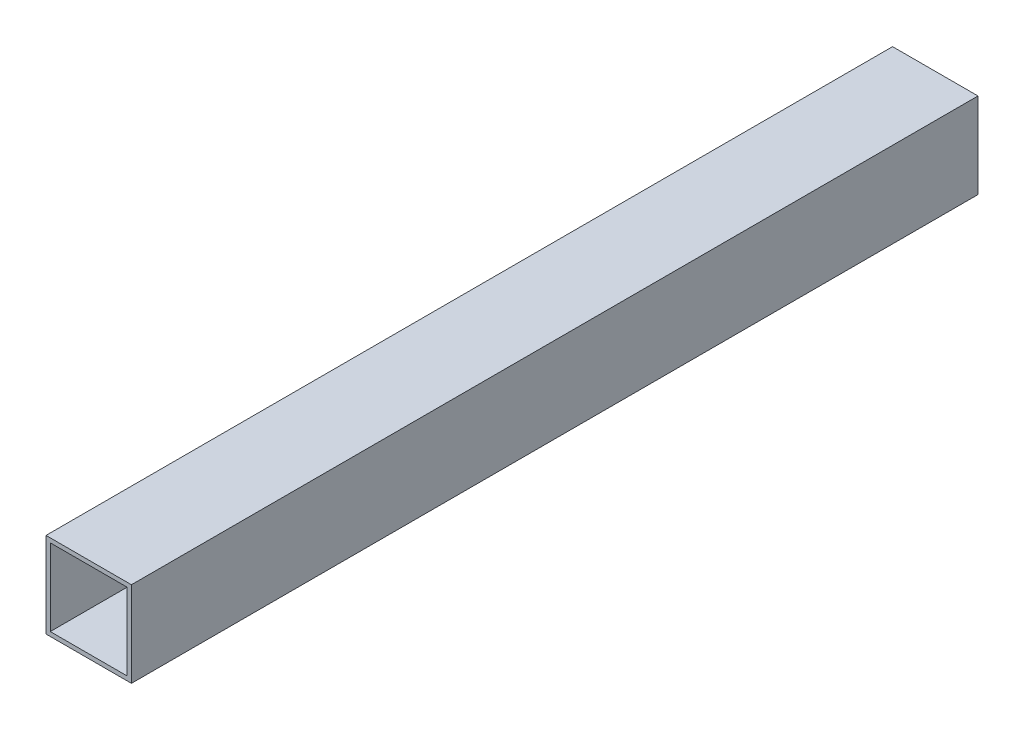
ISO-10303-21;
HEADER;
FILE_DESCRIPTION(('STEP AP214'),'2;1');
FILE_NAME('part.step','',(''),(''),'','','');
FILE_SCHEMA(('AUTOMOTIVE_DESIGN { 1 0 10303 214 1 1 1 1 }'));
ENDSEC;
DATA;
#1=APPLICATION_CONTEXT('core data for automotive mechanical design processes');
#2=APPLICATION_PROTOCOL_DEFINITION('international standard','automotive_design',2000,#1);
#3=PRODUCT_CONTEXT('',#1,'mechanical');
#4=PRODUCT('Part','Part','',(#3));
#5=PRODUCT_RELATED_PRODUCT_CATEGORY('part','',(#4));
#6=PRODUCT_DEFINITION_FORMATION('','',#4);
#7=PRODUCT_DEFINITION_CONTEXT('part definition',#1,'design');
#8=PRODUCT_DEFINITION('design','',#6,#7);
#9=PRODUCT_DEFINITION_SHAPE('','',#8);
#10=(LENGTH_UNIT() NAMED_UNIT(*) SI_UNIT(.MILLI.,.METRE.));
#11=(NAMED_UNIT(*) PLANE_ANGLE_UNIT() SI_UNIT($,.RADIAN.));
#12=(NAMED_UNIT(*) SI_UNIT($,.STERADIAN.) SOLID_ANGLE_UNIT());
#13=UNCERTAINTY_MEASURE_WITH_UNIT(LENGTH_MEASURE(1.E-05),#10,'distance_accuracy_value','');
#14=(GEOMETRIC_REPRESENTATION_CONTEXT(3) GLOBAL_UNCERTAINTY_ASSIGNED_CONTEXT((#13)) GLOBAL_UNIT_ASSIGNED_CONTEXT((#10,
#11,#12)) REPRESENTATION_CONTEXT('',''));
#15=CARTESIAN_POINT('',(0.,0.,0.));
#16=DIRECTION('',(0.,0.,1.));
#17=DIRECTION('',(1.,0.,0.));
#18=AXIS2_PLACEMENT_3D('',#15,#16,#17);
#19=CARTESIAN_POINT('',(0.,0.,198.2));
#20=DIRECTION('',(0.,0.,-1.));
#21=DIRECTION('',(-1.,0.,0.));
#22=AXIS2_PLACEMENT_3D('',#19,#20,#21);
#23=PLANE('',#22);
#24=DIRECTION('',(0.,1.,0.));
#25=VECTOR('',#24,1.);
#26=CARTESIAN_POINT('',(10.,-10.,198.2));
#27=LINE('',#26,#25);
#28=CARTESIAN_POINT('',(10.,-10.,198.2));
#29=VERTEX_POINT('',#28);
#30=CARTESIAN_POINT('',(10.,10.,198.2));
#31=VERTEX_POINT('',#30);
#32=EDGE_CURVE('E159',#29,#31,#27,.T.);
#33=ORIENTED_EDGE('',*,*,#32,.T.);
#34=DIRECTION('',(-1.,0.,0.));
#35=VECTOR('',#34,1.);
#36=CARTESIAN_POINT('',(-10.,10.,198.2));
#37=LINE('',#36,#35);
#38=CARTESIAN_POINT('',(-10.,10.,198.2));
#39=VERTEX_POINT('',#38);
#40=EDGE_CURVE('E163',#31,#39,#37,.T.);
#41=ORIENTED_EDGE('',*,*,#40,.T.);
#42=DIRECTION('',(0.,-1.,0.));
#43=VECTOR('',#42,1.);
#44=CARTESIAN_POINT('',(-10.,-10.,198.2));
#45=LINE('',#44,#43);
#46=CARTESIAN_POINT('',(-10.,-10.,198.2));
#47=VERTEX_POINT('',#46);
#48=EDGE_CURVE('E167',#39,#47,#45,.T.);
#49=ORIENTED_EDGE('',*,*,#48,.T.);
#50=DIRECTION('',(1.,0.,0.));
#51=VECTOR('',#50,1.);
#52=CARTESIAN_POINT('',(-10.,-10.,198.2));
#53=LINE('',#52,#51);
#54=EDGE_CURVE('E170',#47,#29,#53,.T.);
#55=ORIENTED_EDGE('',*,*,#54,.T.);
#56=EDGE_LOOP('',(#33,#41,#49,#55));
#57=FACE_BOUND('',#56,.T.);
#58=DIRECTION('',(0.,1.,0.));
#59=VECTOR('',#58,1.);
#60=CARTESIAN_POINT('',(9.,-9.,198.2));
#61=LINE('',#60,#59);
#62=CARTESIAN_POINT('',(9.,-9.,198.2));
#63=VERTEX_POINT('',#62);
#64=CARTESIAN_POINT('',(9.,9.,198.2));
#65=VERTEX_POINT('',#64);
#66=EDGE_CURVE('E111',#63,#65,#61,.T.);
#67=ORIENTED_EDGE('',*,*,#66,.F.);
#68=DIRECTION('',(1.,0.,0.));
#69=VECTOR('',#68,1.);
#70=CARTESIAN_POINT('',(-9.,-9.,198.2));
#71=LINE('',#70,#69);
#72=CARTESIAN_POINT('',(-9.,-9.,198.2));
#73=VERTEX_POINT('',#72);
#74=EDGE_CURVE('E137',#73,#63,#71,.T.);
#75=ORIENTED_EDGE('',*,*,#74,.F.);
#76=DIRECTION('',(0.,-1.,0.));
#77=VECTOR('',#76,1.);
#78=CARTESIAN_POINT('',(-9.,-9.,198.2));
#79=LINE('',#78,#77);
#80=CARTESIAN_POINT('',(-9.,9.,198.2));
#81=VERTEX_POINT('',#80);
#82=EDGE_CURVE('E133',#81,#73,#79,.T.);
#83=ORIENTED_EDGE('',*,*,#82,.F.);
#84=DIRECTION('',(-1.,0.,0.));
#85=VECTOR('',#84,1.);
#86=CARTESIAN_POINT('',(-9.,9.,198.2));
#87=LINE('',#86,#85);
#88=EDGE_CURVE('E120',#65,#81,#87,.T.);
#89=ORIENTED_EDGE('',*,*,#88,.F.);
#90=EDGE_LOOP('',(#67,#75,#83,#89));
#91=FACE_BOUND('',#90,.T.);
#92=ADVANCED_FACE('F45',(#57,#91),#23,.F.);
#93=CARTESIAN_POINT('',(0.,0.,0.));
#94=DIRECTION('',(0.,0.,-1.));
#95=DIRECTION('',(-1.,0.,0.));
#96=AXIS2_PLACEMENT_3D('',#93,#94,#95);
#97=PLANE('',#96);
#98=DIRECTION('',(0.,1.,0.));
#99=VECTOR('',#98,1.);
#100=CARTESIAN_POINT('',(10.,-10.,0.));
#101=LINE('',#100,#99);
#102=CARTESIAN_POINT('',(10.,-10.,0.));
#103=VERTEX_POINT('',#102);
#104=CARTESIAN_POINT('',(10.,10.,0.));
#105=VERTEX_POINT('',#104);
#106=EDGE_CURVE('E129',#103,#105,#101,.T.);
#107=ORIENTED_EDGE('',*,*,#106,.F.);
#108=DIRECTION('',(1.,0.,0.));
#109=VECTOR('',#108,1.);
#110=CARTESIAN_POINT('',(-10.,-10.,0.));
#111=LINE('',#110,#109);
#112=CARTESIAN_POINT('',(-10.,-10.,0.));
#113=VERTEX_POINT('',#112);
#114=EDGE_CURVE('E164',#113,#103,#111,.T.);
#115=ORIENTED_EDGE('',*,*,#114,.F.);
#116=DIRECTION('',(0.,-1.,0.));
#117=VECTOR('',#116,1.);
#118=CARTESIAN_POINT('',(-10.,-10.,0.));
#119=LINE('',#118,#117);
#120=CARTESIAN_POINT('',(-10.,10.,0.));
#121=VERTEX_POINT('',#120);
#122=EDGE_CURVE('E180',#121,#113,#119,.T.);
#123=ORIENTED_EDGE('',*,*,#122,.F.);
#124=DIRECTION('',(-1.,0.,0.));
#125=VECTOR('',#124,1.);
#126=CARTESIAN_POINT('',(-10.,10.,0.));
#127=LINE('',#126,#125);
#128=EDGE_CURVE('E177',#105,#121,#127,.T.);
#129=ORIENTED_EDGE('',*,*,#128,.F.);
#130=EDGE_LOOP('',(#107,#115,#123,#129));
#131=FACE_BOUND('',#130,.T.);
#132=DIRECTION('',(1.,0.,0.));
#133=VECTOR('',#132,1.);
#134=CARTESIAN_POINT('',(-9.,-9.,0.));
#135=LINE('',#134,#133);
#136=CARTESIAN_POINT('',(-9.,-9.,0.));
#137=VERTEX_POINT('',#136);
#138=CARTESIAN_POINT('',(9.,-9.,0.));
#139=VERTEX_POINT('',#138);
#140=EDGE_CURVE('E121',#137,#139,#135,.T.);
#141=ORIENTED_EDGE('',*,*,#140,.T.);
#142=DIRECTION('',(0.,1.,0.));
#143=VECTOR('',#142,1.);
#144=CARTESIAN_POINT('',(9.,-9.,0.));
#145=LINE('',#144,#143);
#146=CARTESIAN_POINT('',(9.,9.,0.));
#147=VERTEX_POINT('',#146);
#148=EDGE_CURVE('E69',#139,#147,#145,.T.);
#149=ORIENTED_EDGE('',*,*,#148,.T.);
#150=DIRECTION('',(-1.,0.,0.));
#151=VECTOR('',#150,1.);
#152=CARTESIAN_POINT('',(-9.,9.,0.));
#153=LINE('',#152,#151);
#154=CARTESIAN_POINT('',(-9.,9.,0.));
#155=VERTEX_POINT('',#154);
#156=EDGE_CURVE('E127',#147,#155,#153,.T.);
#157=ORIENTED_EDGE('',*,*,#156,.T.);
#158=DIRECTION('',(0.,-1.,0.));
#159=VECTOR('',#158,1.);
#160=CARTESIAN_POINT('',(-9.,-9.,0.));
#161=LINE('',#160,#159);
#162=EDGE_CURVE('E146',#155,#137,#161,.T.);
#163=ORIENTED_EDGE('',*,*,#162,.T.);
#164=EDGE_LOOP('',(#141,#149,#157,#163));
#165=FACE_BOUND('',#164,.T.);
#166=ADVANCED_FACE('F203',(#131,#165),#97,.T.);
#167=CARTESIAN_POINT('',(10.,-10.,198.2));
#168=DIRECTION('',(-1.,0.,0.));
#169=DIRECTION('',(0.,0.,1.));
#170=AXIS2_PLACEMENT_3D('',#167,#168,#169);
#171=PLANE('',#170);
#172=ORIENTED_EDGE('',*,*,#106,.T.);
#173=DIRECTION('',(0.,0.,-1.));
#174=VECTOR('',#173,1.);
#175=CARTESIAN_POINT('',(10.,10.,198.2));
#176=LINE('',#175,#174);
#177=EDGE_CURVE('E11',#31,#105,#176,.T.);
#178=ORIENTED_EDGE('',*,*,#177,.F.);
#179=ORIENTED_EDGE('',*,*,#32,.F.);
#180=DIRECTION('',(0.,0.,-1.));
#181=VECTOR('',#180,1.);
#182=CARTESIAN_POINT('',(10.,-10.,198.2));
#183=LINE('',#182,#181);
#184=EDGE_CURVE('E173',#29,#103,#183,.T.);
#185=ORIENTED_EDGE('',*,*,#184,.T.);
#186=EDGE_LOOP('',(#172,#178,#179,#185));
#187=FACE_BOUND('',#186,.T.);
#188=ADVANCED_FACE('F47',(#187),#171,.F.);
#189=CARTESIAN_POINT('',(-10.,10.,198.2));
#190=DIRECTION('',(0.,-1.,0.));
#191=DIRECTION('',(0.,0.,-1.));
#192=AXIS2_PLACEMENT_3D('',#189,#190,#191);
#193=PLANE('',#192);
#194=ORIENTED_EDGE('',*,*,#128,.T.);
#195=DIRECTION('',(0.,0.,-1.));
#196=VECTOR('',#195,1.);
#197=CARTESIAN_POINT('',(-10.,10.,198.2));
#198=LINE('',#197,#196);
#199=EDGE_CURVE('E54',#39,#121,#198,.T.);
#200=ORIENTED_EDGE('',*,*,#199,.F.);
#201=ORIENTED_EDGE('',*,*,#40,.F.);
#202=ORIENTED_EDGE('',*,*,#177,.T.);
#203=EDGE_LOOP('',(#194,#200,#201,#202));
#204=FACE_BOUND('',#203,.T.);
#205=ADVANCED_FACE('F213',(#204),#193,.F.);
#206=CARTESIAN_POINT('',(-10.,-10.,198.2));
#207=DIRECTION('',(1.,0.,0.));
#208=DIRECTION('',(0.,0.,-1.));
#209=AXIS2_PLACEMENT_3D('',#206,#207,#208);
#210=PLANE('',#209);
#211=ORIENTED_EDGE('',*,*,#122,.T.);
#212=DIRECTION('',(0.,0.,-1.));
#213=VECTOR('',#212,1.);
#214=CARTESIAN_POINT('',(-10.,-10.,198.2));
#215=LINE('',#214,#213);
#216=EDGE_CURVE('E188',#47,#113,#215,.T.);
#217=ORIENTED_EDGE('',*,*,#216,.F.);
#218=ORIENTED_EDGE('',*,*,#48,.F.);
#219=ORIENTED_EDGE('',*,*,#199,.T.);
#220=EDGE_LOOP('',(#211,#217,#218,#219));
#221=FACE_BOUND('',#220,.T.);
#222=ADVANCED_FACE('F197',(#221),#210,.F.);
#223=CARTESIAN_POINT('',(-10.,-10.,198.2));
#224=DIRECTION('',(0.,1.,0.));
#225=DIRECTION('',(0.,0.,1.));
#226=AXIS2_PLACEMENT_3D('',#223,#224,#225);
#227=PLANE('',#226);
#228=ORIENTED_EDGE('',*,*,#114,.T.);
#229=ORIENTED_EDGE('',*,*,#184,.F.);
#230=ORIENTED_EDGE('',*,*,#54,.F.);
#231=ORIENTED_EDGE('',*,*,#216,.T.);
#232=EDGE_LOOP('',(#228,#229,#230,#231));
#233=FACE_BOUND('',#232,.T.);
#234=ADVANCED_FACE('F207',(#233),#227,.F.);
#235=CARTESIAN_POINT('',(9.,-9.,198.2));
#236=DIRECTION('',(-1.,0.,0.));
#237=DIRECTION('',(0.,0.,1.));
#238=AXIS2_PLACEMENT_3D('',#235,#236,#237);
#239=PLANE('',#238);
#240=ORIENTED_EDGE('',*,*,#148,.F.);
#241=DIRECTION('',(0.,0.,-1.));
#242=VECTOR('',#241,1.);
#243=CARTESIAN_POINT('',(9.,-9.,198.2));
#244=LINE('',#243,#242);
#245=EDGE_CURVE('E115',#63,#139,#244,.T.);
#246=ORIENTED_EDGE('',*,*,#245,.F.);
#247=ORIENTED_EDGE('',*,*,#66,.T.);
#248=DIRECTION('',(0.,0.,-1.));
#249=VECTOR('',#248,1.);
#250=CARTESIAN_POINT('',(9.,9.,198.2));
#251=LINE('',#250,#249);
#252=EDGE_CURVE('E114',#65,#147,#251,.T.);
#253=ORIENTED_EDGE('',*,*,#252,.T.);
#254=EDGE_LOOP('',(#240,#246,#247,#253));
#255=FACE_BOUND('',#254,.T.);
#256=ADVANCED_FACE('F113',(#255),#239,.T.);
#257=CARTESIAN_POINT('',(-9.,9.,198.2));
#258=DIRECTION('',(0.,-1.,0.));
#259=DIRECTION('',(0.,0.,-1.));
#260=AXIS2_PLACEMENT_3D('',#257,#258,#259);
#261=PLANE('',#260);
#262=ORIENTED_EDGE('',*,*,#156,.F.);
#263=ORIENTED_EDGE('',*,*,#252,.F.);
#264=ORIENTED_EDGE('',*,*,#88,.T.);
#265=DIRECTION('',(0.,0.,-1.));
#266=VECTOR('',#265,1.);
#267=CARTESIAN_POINT('',(-9.,9.,198.2));
#268=LINE('',#267,#266);
#269=EDGE_CURVE('E130',#81,#155,#268,.T.);
#270=ORIENTED_EDGE('',*,*,#269,.T.);
#271=EDGE_LOOP('',(#262,#263,#264,#270));
#272=FACE_BOUND('',#271,.T.);
#273=ADVANCED_FACE('F124',(#272),#261,.T.);
#274=CARTESIAN_POINT('',(-9.,-9.,198.2));
#275=DIRECTION('',(1.,0.,0.));
#276=DIRECTION('',(0.,0.,-1.));
#277=AXIS2_PLACEMENT_3D('',#274,#275,#276);
#278=PLANE('',#277);
#279=ORIENTED_EDGE('',*,*,#162,.F.);
#280=ORIENTED_EDGE('',*,*,#269,.F.);
#281=ORIENTED_EDGE('',*,*,#82,.T.);
#282=DIRECTION('',(0.,0.,-1.));
#283=VECTOR('',#282,1.);
#284=CARTESIAN_POINT('',(-9.,-9.,198.2));
#285=LINE('',#284,#283);
#286=EDGE_CURVE('E61',#73,#137,#285,.T.);
#287=ORIENTED_EDGE('',*,*,#286,.T.);
#288=EDGE_LOOP('',(#279,#280,#281,#287));
#289=FACE_BOUND('',#288,.T.);
#290=ADVANCED_FACE('F236',(#289),#278,.T.);
#291=CARTESIAN_POINT('',(-9.,-9.,198.2));
#292=DIRECTION('',(0.,1.,0.));
#293=DIRECTION('',(0.,0.,1.));
#294=AXIS2_PLACEMENT_3D('',#291,#292,#293);
#295=PLANE('',#294);
#296=ORIENTED_EDGE('',*,*,#140,.F.);
#297=ORIENTED_EDGE('',*,*,#286,.F.);
#298=ORIENTED_EDGE('',*,*,#74,.T.);
#299=ORIENTED_EDGE('',*,*,#245,.T.);
#300=EDGE_LOOP('',(#296,#297,#298,#299));
#301=FACE_BOUND('',#300,.T.);
#302=ADVANCED_FACE('F240',(#301),#295,.T.);
#303=CLOSED_SHELL('',(#92,#166,#188,#205,#222,#234,#256,#273,#290,#302));
#304=MANIFOLD_SOLID_BREP('B2',#303);
#305=ADVANCED_BREP_SHAPE_REPRESENTATION('',(#18,#304),#14);
#306=SHAPE_DEFINITION_REPRESENTATION(#9,#305);
ENDSEC;
END-ISO-10303-21;
